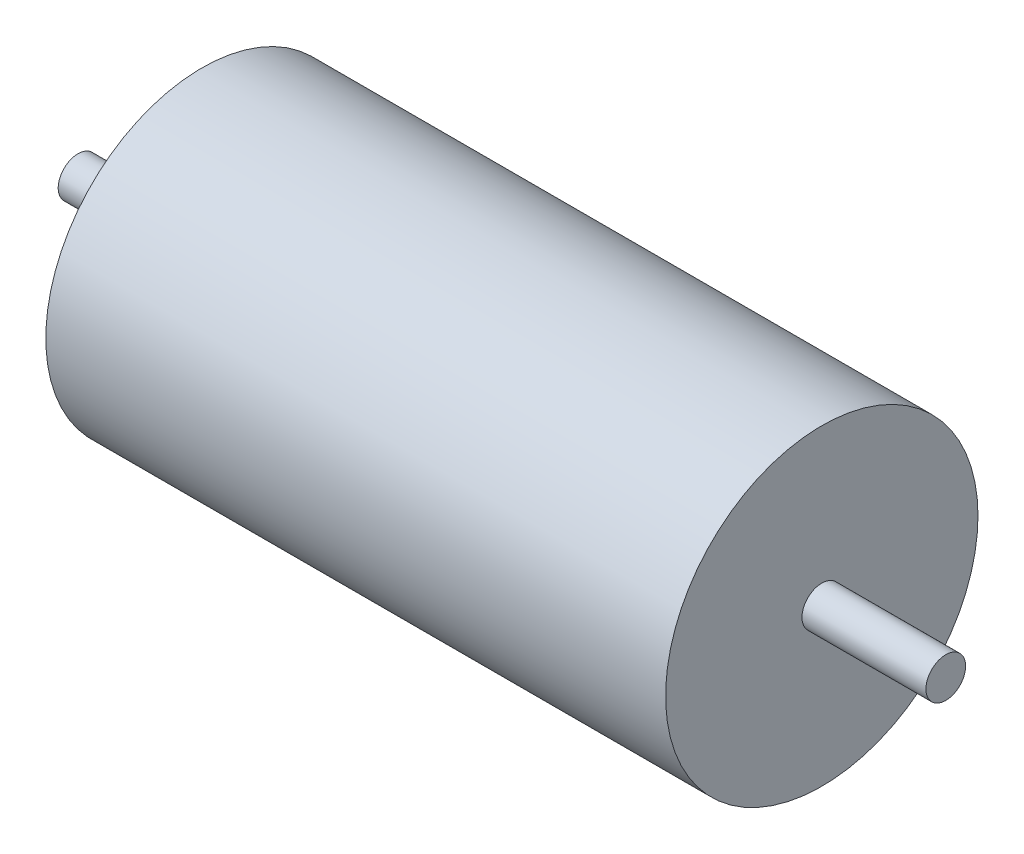
ISO-10303-21;
HEADER;
FILE_DESCRIPTION(('STEP AP214'),'2;1');
FILE_NAME('part.step','',(''),(''),'','','');
FILE_SCHEMA(('AUTOMOTIVE_DESIGN { 1 0 10303 214 1 1 1 1 }'));
ENDSEC;
DATA;
#1=APPLICATION_CONTEXT('core data for automotive mechanical design processes');
#2=APPLICATION_PROTOCOL_DEFINITION('international standard','automotive_design',2000,#1);
#3=PRODUCT_CONTEXT('',#1,'mechanical');
#4=PRODUCT('Part','Part','',(#3));
#5=PRODUCT_RELATED_PRODUCT_CATEGORY('part','',(#4));
#6=PRODUCT_DEFINITION_FORMATION('','',#4);
#7=PRODUCT_DEFINITION_CONTEXT('part definition',#1,'design');
#8=PRODUCT_DEFINITION('design','',#6,#7);
#9=PRODUCT_DEFINITION_SHAPE('','',#8);
#10=(LENGTH_UNIT() NAMED_UNIT(*) SI_UNIT(.MILLI.,.METRE.));
#11=(NAMED_UNIT(*) PLANE_ANGLE_UNIT() SI_UNIT($,.RADIAN.));
#12=(NAMED_UNIT(*) SI_UNIT($,.STERADIAN.) SOLID_ANGLE_UNIT());
#13=UNCERTAINTY_MEASURE_WITH_UNIT(LENGTH_MEASURE(1.E-05),#10,'distance_accuracy_value','');
#14=(GEOMETRIC_REPRESENTATION_CONTEXT(3) GLOBAL_UNCERTAINTY_ASSIGNED_CONTEXT((#13)) GLOBAL_UNIT_ASSIGNED_CONTEXT((#10,
#11,#12)) REPRESENTATION_CONTEXT('',''));
#15=CARTESIAN_POINT('',(0.,0.,0.));
#16=DIRECTION('',(0.,0.,1.));
#17=DIRECTION('',(1.,0.,0.));
#18=AXIS2_PLACEMENT_3D('',#15,#16,#17);
#19=CARTESIAN_POINT('',(125.,0.,0.));
#20=DIRECTION('',(1.,0.,0.));
#21=DIRECTION('',(0.,0.,-1.));
#22=AXIS2_PLACEMENT_3D('',#19,#20,#21);
#23=PLANE('',#22);
#24=CARTESIAN_POINT('',(125.,0.,0.));
#25=DIRECTION('',(1.,0.,0.));
#26=DIRECTION('',(0.,0.,-1.));
#27=AXIS2_PLACEMENT_3D('',#24,#25,#26);
#28=CIRCLE('',#27,31.5);
#29=CARTESIAN_POINT('',(125.,0.,-31.5));
#30=VERTEX_POINT('',#29);
#31=EDGE_CURVE('E10',#30,#30,#28,.T.);
#32=ORIENTED_EDGE('',*,*,#31,.T.);
#33=EDGE_LOOP('',(#32));
#34=FACE_BOUND('',#33,.T.);
#35=CARTESIAN_POINT('',(125.,0.,0.));
#36=DIRECTION('',(1.,0.,0.));
#37=DIRECTION('',(0.,0.,-1.));
#38=AXIS2_PLACEMENT_3D('',#35,#36,#37);
#39=CIRCLE('',#38,4.);
#40=CARTESIAN_POINT('',(125.,0.,-4.));
#41=VERTEX_POINT('',#40);
#42=EDGE_CURVE('E52',#41,#41,#39,.T.);
#43=ORIENTED_EDGE('',*,*,#42,.F.);
#44=EDGE_LOOP('',(#43));
#45=FACE_BOUND('',#44,.T.);
#46=ADVANCED_FACE('F39',(#34,#45),#23,.T.);
#47=CARTESIAN_POINT('',(0.,0.,0.));
#48=DIRECTION('',(1.,0.,0.));
#49=DIRECTION('',(0.,0.,-1.));
#50=AXIS2_PLACEMENT_3D('',#47,#48,#49);
#51=PLANE('',#50);
#52=CARTESIAN_POINT('',(0.,0.,0.));
#53=DIRECTION('',(1.,0.,0.));
#54=DIRECTION('',(0.,0.,-1.));
#55=AXIS2_PLACEMENT_3D('',#52,#53,#54);
#56=CIRCLE('',#55,31.5);
#57=CARTESIAN_POINT('',(0.,0.,-31.5));
#58=VERTEX_POINT('',#57);
#59=EDGE_CURVE('E43',#58,#58,#56,.T.);
#60=ORIENTED_EDGE('',*,*,#59,.F.);
#61=EDGE_LOOP('',(#60));
#62=FACE_BOUND('',#61,.T.);
#63=CARTESIAN_POINT('',(0.,0.,0.));
#64=DIRECTION('',(1.,0.,0.));
#65=DIRECTION('',(0.,0.,-1.));
#66=AXIS2_PLACEMENT_3D('',#63,#64,#65);
#67=CIRCLE('',#66,4.);
#68=CARTESIAN_POINT('',(0.,0.,-4.));
#69=VERTEX_POINT('',#68);
#70=EDGE_CURVE('E57',#69,#69,#67,.T.);
#71=ORIENTED_EDGE('',*,*,#70,.T.);
#72=EDGE_LOOP('',(#71));
#73=FACE_BOUND('',#72,.T.);
#74=ADVANCED_FACE('F87',(#62,#73),#51,.F.);
#75=CARTESIAN_POINT('',(125.,0.,0.));
#76=DIRECTION('',(-1.,0.,0.));
#77=DIRECTION('',(0.,0.,1.));
#78=AXIS2_PLACEMENT_3D('',#75,#76,#77);
#79=CYLINDRICAL_SURFACE('',#78,31.5);
#80=ORIENTED_EDGE('',*,*,#31,.F.);
#81=EDGE_LOOP('',(#80));
#82=FACE_BOUND('',#81,.T.);
#83=ORIENTED_EDGE('',*,*,#59,.T.);
#84=EDGE_LOOP('',(#83));
#85=FACE_BOUND('',#84,.T.);
#86=ADVANCED_FACE('F41',(#82,#85),#79,.T.);
#87=CARTESIAN_POINT('',(-25.,0.,0.));
#88=DIRECTION('',(1.,0.,0.));
#89=DIRECTION('',(0.,0.,-1.));
#90=AXIS2_PLACEMENT_3D('',#87,#88,#89);
#91=PLANE('',#90);
#92=CARTESIAN_POINT('',(-25.,0.,0.));
#93=DIRECTION('',(1.,0.,0.));
#94=DIRECTION('',(0.,0.,-1.));
#95=AXIS2_PLACEMENT_3D('',#92,#93,#94);
#96=CIRCLE('',#95,4.);
#97=CARTESIAN_POINT('',(-25.,0.,-4.));
#98=VERTEX_POINT('',#97);
#99=EDGE_CURVE('E61',#98,#98,#96,.T.);
#100=ORIENTED_EDGE('',*,*,#99,.F.);
#101=EDGE_LOOP('',(#100));
#102=FACE_BOUND('',#101,.T.);
#103=ADVANCED_FACE('F82',(#102),#91,.F.);
#104=CARTESIAN_POINT('',(-25.,0.,0.));
#105=DIRECTION('',(1.,0.,0.));
#106=DIRECTION('',(0.,0.,-1.));
#107=AXIS2_PLACEMENT_3D('',#104,#105,#106);
#108=CYLINDRICAL_SURFACE('',#107,4.);
#109=ORIENTED_EDGE('',*,*,#99,.T.);
#110=EDGE_LOOP('',(#109));
#111=FACE_BOUND('',#110,.T.);
#112=ORIENTED_EDGE('',*,*,#70,.F.);
#113=EDGE_LOOP('',(#112));
#114=FACE_BOUND('',#113,.T.);
#115=ADVANCED_FACE('F74',(#111,#114),#108,.T.);
#116=ORIENTED_EDGE('',*,*,#42,.T.);
#117=EDGE_LOOP('',(#116));
#118=FACE_BOUND('',#117,.T.);
#119=CARTESIAN_POINT('',(150.,0.,0.));
#120=DIRECTION('',(1.,0.,0.));
#121=DIRECTION('',(0.,0.,-1.));
#122=AXIS2_PLACEMENT_3D('',#119,#120,#121);
#123=CIRCLE('',#122,4.);
#124=CARTESIAN_POINT('',(150.,0.,-4.));
#125=VERTEX_POINT('',#124);
#126=EDGE_CURVE('E65',#125,#125,#123,.T.);
#127=ORIENTED_EDGE('',*,*,#126,.F.);
#128=EDGE_LOOP('',(#127));
#129=FACE_BOUND('',#128,.T.);
#130=ADVANCED_FACE('F72',(#118,#129),#108,.T.);
#131=CARTESIAN_POINT('',(150.,0.,0.));
#132=DIRECTION('',(1.,0.,0.));
#133=DIRECTION('',(0.,0.,-1.));
#134=AXIS2_PLACEMENT_3D('',#131,#132,#133);
#135=PLANE('',#134);
#136=ORIENTED_EDGE('',*,*,#126,.T.);
#137=EDGE_LOOP('',(#136));
#138=FACE_BOUND('',#137,.T.);
#139=ADVANCED_FACE('F70',(#138),#135,.T.);
#140=CLOSED_SHELL('',(#46,#74,#86,#103,#115,#130,#139));
#141=MANIFOLD_SOLID_BREP('B2',#140);
#142=ADVANCED_BREP_SHAPE_REPRESENTATION('',(#18,#141),#14);
#143=SHAPE_DEFINITION_REPRESENTATION(#9,#142);
ENDSEC;
END-ISO-10303-21;
